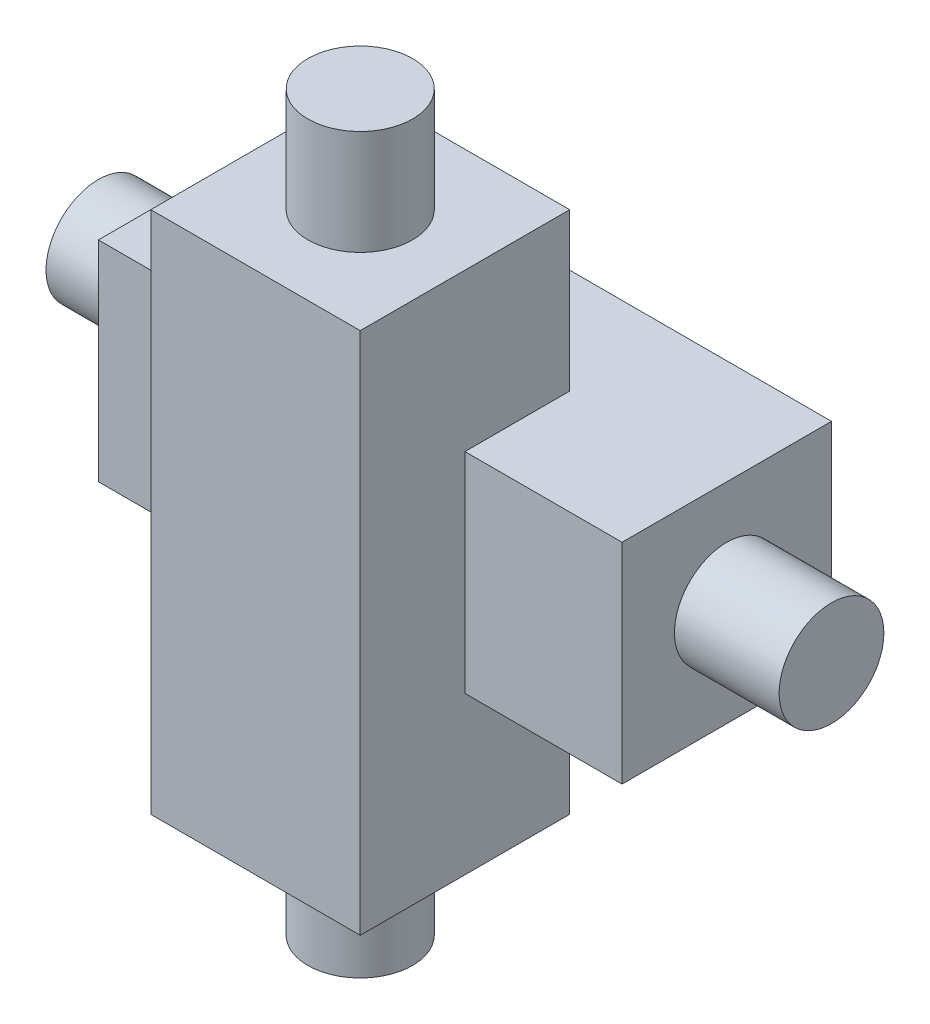
ISO-10303-21;
HEADER;
FILE_DESCRIPTION(('STEP AP214'),'2;1');
FILE_NAME('part.step','',(''),(''),'','','');
FILE_SCHEMA(('AUTOMOTIVE_DESIGN { 1 0 10303 214 1 1 1 1 }'));
ENDSEC;
DATA;
#1=APPLICATION_CONTEXT('core data for automotive mechanical design processes');
#2=APPLICATION_PROTOCOL_DEFINITION('international standard','automotive_design',2000,#1);
#3=PRODUCT_CONTEXT('',#1,'mechanical');
#4=PRODUCT('Part','Part','',(#3));
#5=PRODUCT_RELATED_PRODUCT_CATEGORY('part','',(#4));
#6=PRODUCT_DEFINITION_FORMATION('','',#4);
#7=PRODUCT_DEFINITION_CONTEXT('part definition',#1,'design');
#8=PRODUCT_DEFINITION('design','',#6,#7);
#9=PRODUCT_DEFINITION_SHAPE('','',#8);
#10=(LENGTH_UNIT() NAMED_UNIT(*) SI_UNIT(.MILLI.,.METRE.));
#11=(NAMED_UNIT(*) PLANE_ANGLE_UNIT() SI_UNIT($,.RADIAN.));
#12=(NAMED_UNIT(*) SI_UNIT($,.STERADIAN.) SOLID_ANGLE_UNIT());
#13=UNCERTAINTY_MEASURE_WITH_UNIT(LENGTH_MEASURE(1.E-05),#10,'distance_accuracy_value','');
#14=(GEOMETRIC_REPRESENTATION_CONTEXT(3) GLOBAL_UNCERTAINTY_ASSIGNED_CONTEXT((#13)) GLOBAL_UNIT_ASSIGNED_CONTEXT((#10,
#11,#12)) REPRESENTATION_CONTEXT('',''));
#15=CARTESIAN_POINT('',(0.,0.,0.));
#16=DIRECTION('',(0.,0.,1.));
#17=DIRECTION('',(1.,0.,0.));
#18=AXIS2_PLACEMENT_3D('',#15,#16,#17);
#19=CARTESIAN_POINT('',(10.,25.,-10.));
#20=DIRECTION('',(-1.,0.,0.));
#21=DIRECTION('',(0.,0.,1.));
#22=AXIS2_PLACEMENT_3D('',#19,#20,#21);
#23=PLANE('',#22);
#24=DIRECTION('',(0.,0.,1.));
#25=VECTOR('',#24,1.);
#26=CARTESIAN_POINT('',(10.,10.,-10.));
#27=LINE('',#26,#25);
#28=CARTESIAN_POINT('',(10.,10.,-10.));
#29=VERTEX_POINT('',#28);
#30=CARTESIAN_POINT('',(10.,10.,0.));
#31=VERTEX_POINT('',#30);
#32=EDGE_CURVE('E174',#29,#31,#27,.T.);
#33=ORIENTED_EDGE('',*,*,#32,.F.);
#34=DIRECTION('',(0.,-1.,0.));
#35=VECTOR('',#34,1.);
#36=CARTESIAN_POINT('',(10.,25.,-10.));
#37=LINE('',#36,#35);
#38=CARTESIAN_POINT('',(10.,25.,-10.));
#39=VERTEX_POINT('',#38);
#40=EDGE_CURVE('E218',#39,#29,#37,.T.);
#41=ORIENTED_EDGE('',*,*,#40,.F.);
#42=DIRECTION('',(0.,0.,-1.));
#43=VECTOR('',#42,1.);
#44=CARTESIAN_POINT('',(10.,25.,-10.));
#45=LINE('',#44,#43);
#46=CARTESIAN_POINT('',(10.,25.,10.));
#47=VERTEX_POINT('',#46);
#48=EDGE_CURVE('E178',#47,#39,#45,.T.);
#49=ORIENTED_EDGE('',*,*,#48,.F.);
#50=DIRECTION('',(0.,-1.,0.));
#51=VECTOR('',#50,1.);
#52=CARTESIAN_POINT('',(10.,25.,10.));
#53=LINE('',#52,#51);
#54=CARTESIAN_POINT('',(10.,-25.,10.));
#55=VERTEX_POINT('',#54);
#56=EDGE_CURVE('E192',#47,#55,#53,.T.);
#57=ORIENTED_EDGE('',*,*,#56,.T.);
#58=DIRECTION('',(0.,0.,-1.));
#59=VECTOR('',#58,1.);
#60=CARTESIAN_POINT('',(10.,-25.,-10.));
#61=LINE('',#60,#59);
#62=CARTESIAN_POINT('',(10.,-25.,-10.));
#63=VERTEX_POINT('',#62);
#64=EDGE_CURVE('E177',#55,#63,#61,.T.);
#65=ORIENTED_EDGE('',*,*,#64,.T.);
#66=CARTESIAN_POINT('',(10.,-10.,-10.));
#67=VERTEX_POINT('',#66);
#68=EDGE_CURVE('E217',#67,#63,#37,.T.);
#69=ORIENTED_EDGE('',*,*,#68,.F.);
#70=DIRECTION('',(0.,0.,-1.));
#71=VECTOR('',#70,1.);
#72=CARTESIAN_POINT('',(10.,-10.,-10.));
#73=LINE('',#72,#71);
#74=CARTESIAN_POINT('',(10.,-10.,0.));
#75=VERTEX_POINT('',#74);
#76=EDGE_CURVE('E59',#75,#67,#73,.T.);
#77=ORIENTED_EDGE('',*,*,#76,.F.);
#78=DIRECTION('',(0.,-1.,0.));
#79=VECTOR('',#78,1.);
#80=CARTESIAN_POINT('',(10.,25.,0.));
#81=LINE('',#80,#79);
#82=EDGE_CURVE('E54',#31,#75,#81,.T.);
#83=ORIENTED_EDGE('',*,*,#82,.F.);
#84=EDGE_LOOP('',(#33,#41,#49,#57,#65,#69,#77,#83));
#85=FACE_BOUND('',#84,.T.);
#86=ADVANCED_FACE('F39',(#85),#23,.F.);
#87=CARTESIAN_POINT('',(-10.,25.,-10.));
#88=DIRECTION('',(0.,0.,1.));
#89=DIRECTION('',(1.,0.,0.));
#90=AXIS2_PLACEMENT_3D('',#87,#88,#89);
#91=PLANE('',#90);
#92=DIRECTION('',(1.,0.,0.));
#93=VECTOR('',#92,1.);
#94=CARTESIAN_POINT('',(-10.,10.,-10.));
#95=LINE('',#94,#93);
#96=CARTESIAN_POINT('',(-10.,10.,-10.));
#97=VERTEX_POINT('',#96);
#98=EDGE_CURVE('E171',#97,#29,#95,.T.);
#99=ORIENTED_EDGE('',*,*,#98,.F.);
#100=DIRECTION('',(0.,-1.,0.));
#101=VECTOR('',#100,1.);
#102=CARTESIAN_POINT('',(-10.,25.,-10.));
#103=LINE('',#102,#101);
#104=CARTESIAN_POINT('',(-10.,25.,-10.));
#105=VERTEX_POINT('',#104);
#106=EDGE_CURVE('E213',#105,#97,#103,.T.);
#107=ORIENTED_EDGE('',*,*,#106,.F.);
#108=DIRECTION('',(-1.,0.,0.));
#109=VECTOR('',#108,1.);
#110=CARTESIAN_POINT('',(-10.,25.,-10.));
#111=LINE('',#110,#109);
#112=EDGE_CURVE('E182',#39,#105,#111,.T.);
#113=ORIENTED_EDGE('',*,*,#112,.F.);
#114=ORIENTED_EDGE('',*,*,#40,.T.);
#115=EDGE_LOOP('',(#99,#107,#113,#114));
#116=FACE_BOUND('',#115,.T.);
#117=ADVANCED_FACE('F336',(#116),#91,.F.);
#118=DIRECTION('',(-1.,0.,0.));
#119=VECTOR('',#118,1.);
#120=CARTESIAN_POINT('',(-10.,-10.,-10.));
#121=LINE('',#120,#119);
#122=CARTESIAN_POINT('',(-10.,-10.,-10.));
#123=VERTEX_POINT('',#122);
#124=EDGE_CURVE('E157',#67,#123,#121,.T.);
#125=ORIENTED_EDGE('',*,*,#124,.F.);
#126=ORIENTED_EDGE('',*,*,#68,.T.);
#127=DIRECTION('',(-1.,0.,0.));
#128=VECTOR('',#127,1.);
#129=CARTESIAN_POINT('',(-10.,-25.,-10.));
#130=LINE('',#129,#128);
#131=CARTESIAN_POINT('',(-10.,-25.,-10.));
#132=VERTEX_POINT('',#131);
#133=EDGE_CURVE('E196',#63,#132,#130,.T.);
#134=ORIENTED_EDGE('',*,*,#133,.T.);
#135=EDGE_CURVE('E212',#123,#132,#103,.T.);
#136=ORIENTED_EDGE('',*,*,#135,.F.);
#137=EDGE_LOOP('',(#125,#126,#134,#136));
#138=FACE_BOUND('',#137,.T.);
#139=ADVANCED_FACE('F261',(#138),#91,.F.);
#140=CARTESIAN_POINT('',(-10.,25.,-10.));
#141=DIRECTION('',(1.,0.,0.));
#142=DIRECTION('',(0.,0.,-1.));
#143=AXIS2_PLACEMENT_3D('',#140,#141,#142);
#144=PLANE('',#143);
#145=DIRECTION('',(0.,0.,-1.));
#146=VECTOR('',#145,1.);
#147=CARTESIAN_POINT('',(-10.,10.,-10.));
#148=LINE('',#147,#146);
#149=CARTESIAN_POINT('',(-10.,10.,0.));
#150=VERTEX_POINT('',#149);
#151=EDGE_CURVE('E230',#150,#97,#148,.T.);
#152=ORIENTED_EDGE('',*,*,#151,.F.);
#153=DIRECTION('',(0.,1.,0.));
#154=VECTOR('',#153,1.);
#155=CARTESIAN_POINT('',(-10.,25.,0.));
#156=LINE('',#155,#154);
#157=CARTESIAN_POINT('',(-10.,-10.,0.));
#158=VERTEX_POINT('',#157);
#159=EDGE_CURVE('E226',#158,#150,#156,.T.);
#160=ORIENTED_EDGE('',*,*,#159,.F.);
#161=DIRECTION('',(0.,0.,1.));
#162=VECTOR('',#161,1.);
#163=CARTESIAN_POINT('',(-10.,-10.,-10.));
#164=LINE('',#163,#162);
#165=EDGE_CURVE('E222',#123,#158,#164,.T.);
#166=ORIENTED_EDGE('',*,*,#165,.F.);
#167=ORIENTED_EDGE('',*,*,#135,.T.);
#168=DIRECTION('',(0.,0.,1.));
#169=VECTOR('',#168,1.);
#170=CARTESIAN_POINT('',(-10.,-25.,-10.));
#171=LINE('',#170,#169);
#172=CARTESIAN_POINT('',(-10.,-25.,10.));
#173=VERTEX_POINT('',#172);
#174=EDGE_CURVE('E200',#132,#173,#171,.T.);
#175=ORIENTED_EDGE('',*,*,#174,.T.);
#176=DIRECTION('',(0.,-1.,0.));
#177=VECTOR('',#176,1.);
#178=CARTESIAN_POINT('',(-10.,25.,10.));
#179=LINE('',#178,#177);
#180=CARTESIAN_POINT('',(-10.,25.,10.));
#181=VERTEX_POINT('',#180);
#182=EDGE_CURVE('E208',#181,#173,#179,.T.);
#183=ORIENTED_EDGE('',*,*,#182,.F.);
#184=DIRECTION('',(0.,0.,1.));
#185=VECTOR('',#184,1.);
#186=CARTESIAN_POINT('',(-10.,25.,-10.));
#187=LINE('',#186,#185);
#188=EDGE_CURVE('E186',#105,#181,#187,.T.);
#189=ORIENTED_EDGE('',*,*,#188,.F.);
#190=ORIENTED_EDGE('',*,*,#106,.T.);
#191=EDGE_LOOP('',(#152,#160,#166,#167,#175,#183,#189,#190));
#192=FACE_BOUND('',#191,.T.);
#193=ADVANCED_FACE('F257',(#192),#144,.F.);
#194=CARTESIAN_POINT('',(-10.,25.,10.));
#195=DIRECTION('',(0.,0.,-1.));
#196=DIRECTION('',(-1.,0.,0.));
#197=AXIS2_PLACEMENT_3D('',#194,#195,#196);
#198=PLANE('',#197);
#199=DIRECTION('',(1.,0.,0.));
#200=VECTOR('',#199,1.);
#201=CARTESIAN_POINT('',(-10.,-25.,10.));
#202=LINE('',#201,#200);
#203=EDGE_CURVE('E183',#173,#55,#202,.T.);
#204=ORIENTED_EDGE('',*,*,#203,.T.);
#205=ORIENTED_EDGE('',*,*,#56,.F.);
#206=DIRECTION('',(1.,0.,0.));
#207=VECTOR('',#206,1.);
#208=CARTESIAN_POINT('',(-10.,25.,10.));
#209=LINE('',#208,#207);
#210=EDGE_CURVE('E189',#181,#47,#209,.T.);
#211=ORIENTED_EDGE('',*,*,#210,.F.);
#212=ORIENTED_EDGE('',*,*,#182,.T.);
#213=EDGE_LOOP('',(#204,#205,#211,#212));
#214=FACE_BOUND('',#213,.T.);
#215=ADVANCED_FACE('F253',(#214),#198,.F.);
#216=CARTESIAN_POINT('',(0.,25.,0.));
#217=DIRECTION('',(0.,1.,0.));
#218=DIRECTION('',(0.,0.,1.));
#219=AXIS2_PLACEMENT_3D('',#216,#217,#218);
#220=PLANE('',#219);
#221=CARTESIAN_POINT('',(0.,25.,0.));
#222=DIRECTION('',(0.,1.,0.));
#223=DIRECTION('',(0.,0.,1.));
#224=AXIS2_PLACEMENT_3D('',#221,#222,#223);
#225=CIRCLE('',#224,5.);
#226=CARTESIAN_POINT('',(0.,25.,5.));
#227=VERTEX_POINT('',#226);
#228=EDGE_CURVE('E289',#227,#227,#225,.F.);
#229=ORIENTED_EDGE('',*,*,#228,.T.);
#230=EDGE_LOOP('',(#229));
#231=FACE_BOUND('',#230,.T.);
#232=ORIENTED_EDGE('',*,*,#48,.T.);
#233=ORIENTED_EDGE('',*,*,#112,.T.);
#234=ORIENTED_EDGE('',*,*,#188,.T.);
#235=ORIENTED_EDGE('',*,*,#210,.T.);
#236=EDGE_LOOP('',(#232,#233,#234,#235));
#237=FACE_BOUND('',#236,.T.);
#238=ADVANCED_FACE('F242',(#231,#237),#220,.T.);
#239=CARTESIAN_POINT('',(0.,-25.,0.));
#240=DIRECTION('',(0.,1.,0.));
#241=DIRECTION('',(0.,0.,1.));
#242=AXIS2_PLACEMENT_3D('',#239,#240,#241);
#243=PLANE('',#242);
#244=CARTESIAN_POINT('',(0.,-25.,0.));
#245=DIRECTION('',(0.,1.,0.));
#246=DIRECTION('',(0.,0.,1.));
#247=AXIS2_PLACEMENT_3D('',#244,#245,#246);
#248=CIRCLE('',#247,5.);
#249=CARTESIAN_POINT('',(0.,-25.,5.));
#250=VERTEX_POINT('',#249);
#251=EDGE_CURVE('E47',#250,#250,#248,.F.);
#252=ORIENTED_EDGE('',*,*,#251,.F.);
#253=EDGE_LOOP('',(#252));
#254=FACE_BOUND('',#253,.T.);
#255=ORIENTED_EDGE('',*,*,#64,.F.);
#256=ORIENTED_EDGE('',*,*,#203,.F.);
#257=ORIENTED_EDGE('',*,*,#174,.F.);
#258=ORIENTED_EDGE('',*,*,#133,.F.);
#259=EDGE_LOOP('',(#255,#256,#257,#258));
#260=FACE_BOUND('',#259,.T.);
#261=ADVANCED_FACE('F239',(#254,#260),#243,.F.);
#262=CARTESIAN_POINT('',(25.,10.,0.));
#263=DIRECTION('',(0.,-1.,0.));
#264=DIRECTION('',(0.,0.,-1.));
#265=AXIS2_PLACEMENT_3D('',#262,#263,#264);
#266=PLANE('',#265);
#267=ORIENTED_EDGE('',*,*,#98,.T.);
#268=ORIENTED_EDGE('',*,*,#32,.T.);
#269=DIRECTION('',(-1.,0.,0.));
#270=VECTOR('',#269,1.);
#271=CARTESIAN_POINT('',(25.,10.,0.));
#272=LINE('',#271,#270);
#273=CARTESIAN_POINT('',(25.,10.,0.));
#274=VERTEX_POINT('',#273);
#275=EDGE_CURVE('E136',#274,#31,#272,.T.);
#276=ORIENTED_EDGE('',*,*,#275,.F.);
#277=DIRECTION('',(0.,0.,1.));
#278=VECTOR('',#277,1.);
#279=CARTESIAN_POINT('',(25.,10.,0.));
#280=LINE('',#279,#278);
#281=CARTESIAN_POINT('',(25.,10.,-20.));
#282=VERTEX_POINT('',#281);
#283=EDGE_CURVE('E127',#282,#274,#280,.T.);
#284=ORIENTED_EDGE('',*,*,#283,.F.);
#285=DIRECTION('',(-1.,0.,0.));
#286=VECTOR('',#285,1.);
#287=CARTESIAN_POINT('',(25.,10.,-20.));
#288=LINE('',#287,#286);
#289=CARTESIAN_POINT('',(-25.,10.,-20.));
#290=VERTEX_POINT('',#289);
#291=EDGE_CURVE('E133',#282,#290,#288,.T.);
#292=ORIENTED_EDGE('',*,*,#291,.T.);
#293=DIRECTION('',(0.,0.,1.));
#294=VECTOR('',#293,1.);
#295=CARTESIAN_POINT('',(-25.,10.,0.));
#296=LINE('',#295,#294);
#297=CARTESIAN_POINT('',(-25.,10.,0.));
#298=VERTEX_POINT('',#297);
#299=EDGE_CURVE('E284',#290,#298,#296,.T.);
#300=ORIENTED_EDGE('',*,*,#299,.T.);
#301=EDGE_CURVE('E163',#150,#298,#272,.T.);
#302=ORIENTED_EDGE('',*,*,#301,.F.);
#303=ORIENTED_EDGE('',*,*,#151,.T.);
#304=EDGE_LOOP('',(#267,#268,#276,#284,#292,#300,#302,#303));
#305=FACE_BOUND('',#304,.T.);
#306=ADVANCED_FACE('F130',(#305),#266,.F.);
#307=CARTESIAN_POINT('',(25.,10.,0.));
#308=DIRECTION('',(0.,0.,-1.));
#309=DIRECTION('',(0.,1.,0.));
#310=AXIS2_PLACEMENT_3D('',#307,#308,#309);
#311=PLANE('',#310);
#312=ORIENTED_EDGE('',*,*,#275,.T.);
#313=ORIENTED_EDGE('',*,*,#82,.T.);
#314=DIRECTION('',(-1.,0.,0.));
#315=VECTOR('',#314,1.);
#316=CARTESIAN_POINT('',(25.,-10.,0.));
#317=LINE('',#316,#315);
#318=CARTESIAN_POINT('',(25.,-10.,0.));
#319=VERTEX_POINT('',#318);
#320=EDGE_CURVE('E268',#319,#75,#317,.T.);
#321=ORIENTED_EDGE('',*,*,#320,.F.);
#322=DIRECTION('',(0.,-1.,0.));
#323=VECTOR('',#322,1.);
#324=CARTESIAN_POINT('',(25.,10.,0.));
#325=LINE('',#324,#323);
#326=EDGE_CURVE('E140',#274,#319,#325,.T.);
#327=ORIENTED_EDGE('',*,*,#326,.F.);
#328=EDGE_LOOP('',(#312,#313,#321,#327));
#329=FACE_BOUND('',#328,.T.);
#330=ADVANCED_FACE('F356',(#329),#311,.F.);
#331=CARTESIAN_POINT('',(-25.,-10.,0.));
#332=VERTEX_POINT('',#331);
#333=EDGE_CURVE('E271',#158,#332,#317,.T.);
#334=ORIENTED_EDGE('',*,*,#333,.F.);
#335=ORIENTED_EDGE('',*,*,#159,.T.);
#336=ORIENTED_EDGE('',*,*,#301,.T.);
#337=DIRECTION('',(0.,-1.,0.));
#338=VECTOR('',#337,1.);
#339=CARTESIAN_POINT('',(-25.,10.,0.));
#340=LINE('',#339,#338);
#341=EDGE_CURVE('E280',#298,#332,#340,.T.);
#342=ORIENTED_EDGE('',*,*,#341,.T.);
#343=EDGE_LOOP('',(#334,#335,#336,#342));
#344=FACE_BOUND('',#343,.T.);
#345=ADVANCED_FACE('F359',(#344),#311,.F.);
#346=CARTESIAN_POINT('',(25.,-10.,0.));
#347=DIRECTION('',(0.,1.,0.));
#348=DIRECTION('',(0.,0.,1.));
#349=AXIS2_PLACEMENT_3D('',#346,#347,#348);
#350=PLANE('',#349);
#351=ORIENTED_EDGE('',*,*,#320,.T.);
#352=ORIENTED_EDGE('',*,*,#76,.T.);
#353=ORIENTED_EDGE('',*,*,#124,.T.);
#354=ORIENTED_EDGE('',*,*,#165,.T.);
#355=ORIENTED_EDGE('',*,*,#333,.T.);
#356=DIRECTION('',(0.,0.,-1.));
#357=VECTOR('',#356,1.);
#358=CARTESIAN_POINT('',(-25.,-10.,0.));
#359=LINE('',#358,#357);
#360=CARTESIAN_POINT('',(-25.,-10.,-20.));
#361=VERTEX_POINT('',#360);
#362=EDGE_CURVE('E151',#332,#361,#359,.T.);
#363=ORIENTED_EDGE('',*,*,#362,.T.);
#364=DIRECTION('',(-1.,0.,0.));
#365=VECTOR('',#364,1.);
#366=CARTESIAN_POINT('',(25.,-10.,-20.));
#367=LINE('',#366,#365);
#368=CARTESIAN_POINT('',(25.,-10.,-20.));
#369=VERTEX_POINT('',#368);
#370=EDGE_CURVE('E274',#369,#361,#367,.T.);
#371=ORIENTED_EDGE('',*,*,#370,.F.);
#372=DIRECTION('',(0.,0.,-1.));
#373=VECTOR('',#372,1.);
#374=CARTESIAN_POINT('',(25.,-10.,0.));
#375=LINE('',#374,#373);
#376=EDGE_CURVE('E146',#319,#369,#375,.T.);
#377=ORIENTED_EDGE('',*,*,#376,.F.);
#378=EDGE_LOOP('',(#351,#352,#353,#354,#355,#363,#371,#377));
#379=FACE_BOUND('',#378,.T.);
#380=ADVANCED_FACE('F265',(#379),#350,.F.);
#381=CARTESIAN_POINT('',(25.,10.,-20.));
#382=DIRECTION('',(0.,0.,1.));
#383=DIRECTION('',(0.,-1.,0.));
#384=AXIS2_PLACEMENT_3D('',#381,#382,#383);
#385=PLANE('',#384);
#386=DIRECTION('',(0.,1.,0.));
#387=VECTOR('',#386,1.);
#388=CARTESIAN_POINT('',(-25.,10.,-20.));
#389=LINE('',#388,#387);
#390=EDGE_CURVE('E155',#361,#290,#389,.T.);
#391=ORIENTED_EDGE('',*,*,#390,.T.);
#392=ORIENTED_EDGE('',*,*,#291,.F.);
#393=DIRECTION('',(0.,1.,0.));
#394=VECTOR('',#393,1.);
#395=CARTESIAN_POINT('',(25.,10.,-20.));
#396=LINE('',#395,#394);
#397=EDGE_CURVE('E141',#369,#282,#396,.T.);
#398=ORIENTED_EDGE('',*,*,#397,.F.);
#399=ORIENTED_EDGE('',*,*,#370,.T.);
#400=EDGE_LOOP('',(#391,#392,#398,#399));
#401=FACE_BOUND('',#400,.T.);
#402=ADVANCED_FACE('F153',(#401),#385,.F.);
#403=CARTESIAN_POINT('',(25.,0.,0.));
#404=DIRECTION('',(1.,0.,0.));
#405=DIRECTION('',(0.,0.,-1.));
#406=AXIS2_PLACEMENT_3D('',#403,#404,#405);
#407=PLANE('',#406);
#408=CARTESIAN_POINT('',(25.,0.,-9.99999999999999));
#409=DIRECTION('',(1.,0.,0.));
#410=DIRECTION('',(0.,0.,-1.));
#411=AXIS2_PLACEMENT_3D('',#408,#409,#410);
#412=CIRCLE('',#411,5.);
#413=CARTESIAN_POINT('',(25.,0.,-15.));
#414=VERTEX_POINT('',#413);
#415=EDGE_CURVE('E302',#414,#414,#412,.F.);
#416=ORIENTED_EDGE('',*,*,#415,.T.);
#417=EDGE_LOOP('',(#416));
#418=FACE_BOUND('',#417,.T.);
#419=ORIENTED_EDGE('',*,*,#397,.T.);
#420=ORIENTED_EDGE('',*,*,#283,.T.);
#421=ORIENTED_EDGE('',*,*,#326,.T.);
#422=ORIENTED_EDGE('',*,*,#376,.T.);
#423=EDGE_LOOP('',(#419,#420,#421,#422));
#424=FACE_BOUND('',#423,.T.);
#425=ADVANCED_FACE('F144',(#418,#424),#407,.T.);
#426=CARTESIAN_POINT('',(-25.,0.,0.));
#427=DIRECTION('',(1.,0.,0.));
#428=DIRECTION('',(0.,0.,-1.));
#429=AXIS2_PLACEMENT_3D('',#426,#427,#428);
#430=PLANE('',#429);
#431=CARTESIAN_POINT('',(-25.,0.,-9.99999999999999));
#432=DIRECTION('',(1.,0.,0.));
#433=DIRECTION('',(0.,0.,-1.));
#434=AXIS2_PLACEMENT_3D('',#431,#432,#433);
#435=CIRCLE('',#434,5.);
#436=CARTESIAN_POINT('',(-25.,0.,-15.));
#437=VERTEX_POINT('',#436);
#438=EDGE_CURVE('E11',#437,#437,#435,.F.);
#439=ORIENTED_EDGE('',*,*,#438,.F.);
#440=EDGE_LOOP('',(#439));
#441=FACE_BOUND('',#440,.T.);
#442=ORIENTED_EDGE('',*,*,#390,.F.);
#443=ORIENTED_EDGE('',*,*,#362,.F.);
#444=ORIENTED_EDGE('',*,*,#341,.F.);
#445=ORIENTED_EDGE('',*,*,#299,.F.);
#446=EDGE_LOOP('',(#442,#443,#444,#445));
#447=FACE_BOUND('',#446,.T.);
#448=ADVANCED_FACE('F362',(#441,#447),#430,.F.);
#449=CARTESIAN_POINT('',(0.,-35.,0.));
#450=DIRECTION('',(0.,1.,0.));
#451=DIRECTION('',(0.,0.,1.));
#452=AXIS2_PLACEMENT_3D('',#449,#450,#451);
#453=PLANE('',#452);
#454=CARTESIAN_POINT('',(0.,-35.,0.));
#455=DIRECTION('',(0.,1.,0.));
#456=DIRECTION('',(0.,0.,1.));
#457=AXIS2_PLACEMENT_3D('',#454,#455,#456);
#458=CIRCLE('',#457,5.);
#459=CARTESIAN_POINT('',(0.,-35.,5.));
#460=VERTEX_POINT('',#459);
#461=EDGE_CURVE('E298',#460,#460,#458,.T.);
#462=ORIENTED_EDGE('',*,*,#461,.F.);
#463=EDGE_LOOP('',(#462));
#464=FACE_BOUND('',#463,.T.);
#465=ADVANCED_FACE('F365',(#464),#453,.F.);
#466=CARTESIAN_POINT('',(0.,35.,0.));
#467=DIRECTION('',(0.,-1.,0.));
#468=DIRECTION('',(0.,0.,-1.));
#469=AXIS2_PLACEMENT_3D('',#466,#467,#468);
#470=CYLINDRICAL_SURFACE('',#469,5.);
#471=ORIENTED_EDGE('',*,*,#461,.T.);
#472=EDGE_LOOP('',(#471));
#473=FACE_BOUND('',#472,.T.);
#474=ORIENTED_EDGE('',*,*,#251,.T.);
#475=EDGE_LOOP('',(#474));
#476=FACE_BOUND('',#475,.T.);
#477=ADVANCED_FACE('F237',(#473,#476),#470,.T.);
#478=ORIENTED_EDGE('',*,*,#228,.F.);
#479=EDGE_LOOP('',(#478));
#480=FACE_BOUND('',#479,.T.);
#481=CARTESIAN_POINT('',(0.,35.,0.));
#482=DIRECTION('',(0.,1.,0.));
#483=DIRECTION('',(0.,0.,1.));
#484=AXIS2_PLACEMENT_3D('',#481,#482,#483);
#485=CIRCLE('',#484,5.);
#486=CARTESIAN_POINT('',(0.,35.,5.));
#487=VERTEX_POINT('',#486);
#488=EDGE_CURVE('E297',#487,#487,#485,.T.);
#489=ORIENTED_EDGE('',*,*,#488,.F.);
#490=EDGE_LOOP('',(#489));
#491=FACE_BOUND('',#490,.T.);
#492=ADVANCED_FACE('F370',(#480,#491),#470,.T.);
#493=CARTESIAN_POINT('',(0.,35.,0.));
#494=DIRECTION('',(0.,1.,0.));
#495=DIRECTION('',(0.,0.,1.));
#496=AXIS2_PLACEMENT_3D('',#493,#494,#495);
#497=PLANE('',#496);
#498=ORIENTED_EDGE('',*,*,#488,.T.);
#499=EDGE_LOOP('',(#498));
#500=FACE_BOUND('',#499,.T.);
#501=ADVANCED_FACE('F373',(#500),#497,.T.);
#502=CARTESIAN_POINT('',(-35.,0.,-9.99999999999999));
#503=DIRECTION('',(1.,0.,0.));
#504=DIRECTION('',(0.,0.,-1.));
#505=AXIS2_PLACEMENT_3D('',#502,#503,#504);
#506=PLANE('',#505);
#507=CARTESIAN_POINT('',(-35.,0.,-9.99999999999999));
#508=DIRECTION('',(1.,0.,0.));
#509=DIRECTION('',(0.,0.,-1.));
#510=AXIS2_PLACEMENT_3D('',#507,#508,#509);
#511=CIRCLE('',#510,5.);
#512=CARTESIAN_POINT('',(-35.,0.,-15.));
#513=VERTEX_POINT('',#512);
#514=EDGE_CURVE('E310',#513,#513,#511,.T.);
#515=ORIENTED_EDGE('',*,*,#514,.F.);
#516=EDGE_LOOP('',(#515));
#517=FACE_BOUND('',#516,.T.);
#518=ADVANCED_FACE('F330',(#517),#506,.F.);
#519=CARTESIAN_POINT('',(35.,0.,-9.99999999999999));
#520=DIRECTION('',(-1.,0.,0.));
#521=DIRECTION('',(0.,0.,1.));
#522=AXIS2_PLACEMENT_3D('',#519,#520,#521);
#523=CYLINDRICAL_SURFACE('',#522,5.);
#524=ORIENTED_EDGE('',*,*,#514,.T.);
#525=EDGE_LOOP('',(#524));
#526=FACE_BOUND('',#525,.T.);
#527=ORIENTED_EDGE('',*,*,#438,.T.);
#528=EDGE_LOOP('',(#527));
#529=FACE_BOUND('',#528,.T.);
#530=ADVANCED_FACE('F322',(#526,#529),#523,.T.);
#531=ORIENTED_EDGE('',*,*,#415,.F.);
#532=EDGE_LOOP('',(#531));
#533=FACE_BOUND('',#532,.T.);
#534=CARTESIAN_POINT('',(35.,0.,-9.99999999999999));
#535=DIRECTION('',(1.,0.,0.));
#536=DIRECTION('',(0.,0.,-1.));
#537=AXIS2_PLACEMENT_3D('',#534,#535,#536);
#538=CIRCLE('',#537,5.);
#539=CARTESIAN_POINT('',(35.,0.,-15.));
#540=VERTEX_POINT('',#539);
#541=EDGE_CURVE('E309',#540,#540,#538,.T.);
#542=ORIENTED_EDGE('',*,*,#541,.F.);
#543=EDGE_LOOP('',(#542));
#544=FACE_BOUND('',#543,.T.);
#545=ADVANCED_FACE('F320',(#533,#544),#523,.T.);
#546=CARTESIAN_POINT('',(35.,0.,-9.99999999999999));
#547=DIRECTION('',(1.,0.,0.));
#548=DIRECTION('',(0.,0.,-1.));
#549=AXIS2_PLACEMENT_3D('',#546,#547,#548);
#550=PLANE('',#549);
#551=ORIENTED_EDGE('',*,*,#541,.T.);
#552=EDGE_LOOP('',(#551));
#553=FACE_BOUND('',#552,.T.);
#554=ADVANCED_FACE('F318',(#553),#550,.T.);
#555=CLOSED_SHELL('',(#86,#117,#139,#193,#215,#238,#261,#306,#330,#345,#380,#402,#425,#448,#465,
#477,#492,#501,#518,#530,#545,#554));
#556=MANIFOLD_SOLID_BREP('B2',#555);
#557=ADVANCED_BREP_SHAPE_REPRESENTATION('',(#18,#556),#14);
#558=SHAPE_DEFINITION_REPRESENTATION(#9,#557);
ENDSEC;
END-ISO-10303-21;
